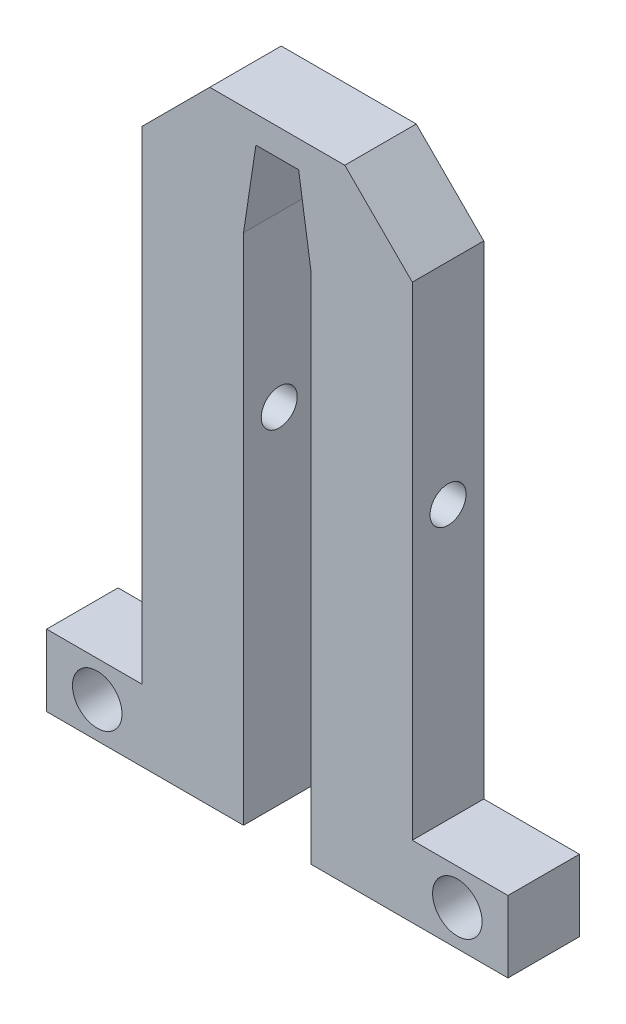
ISO-10303-21;
HEADER;
FILE_DESCRIPTION(('STEP AP214'),'2;1');
FILE_NAME('part.step','',(''),(''),'','','');
FILE_SCHEMA(('AUTOMOTIVE_DESIGN { 1 0 10303 214 1 1 1 1 }'));
ENDSEC;
DATA;
#1=APPLICATION_CONTEXT('core data for automotive mechanical design processes');
#2=APPLICATION_PROTOCOL_DEFINITION('international standard','automotive_design',2000,#1);
#3=PRODUCT_CONTEXT('',#1,'mechanical');
#4=PRODUCT('Part','Part','',(#3));
#5=PRODUCT_RELATED_PRODUCT_CATEGORY('part','',(#4));
#6=PRODUCT_DEFINITION_FORMATION('','',#4);
#7=PRODUCT_DEFINITION_CONTEXT('part definition',#1,'design');
#8=PRODUCT_DEFINITION('design','',#6,#7);
#9=PRODUCT_DEFINITION_SHAPE('','',#8);
#10=(LENGTH_UNIT() NAMED_UNIT(*) SI_UNIT(.MILLI.,.METRE.));
#11=(NAMED_UNIT(*) PLANE_ANGLE_UNIT() SI_UNIT($,.RADIAN.));
#12=(NAMED_UNIT(*) SI_UNIT($,.STERADIAN.) SOLID_ANGLE_UNIT());
#13=UNCERTAINTY_MEASURE_WITH_UNIT(LENGTH_MEASURE(1.E-05),#10,'distance_accuracy_value','');
#14=(GEOMETRIC_REPRESENTATION_CONTEXT(3) GLOBAL_UNCERTAINTY_ASSIGNED_CONTEXT((#13)) GLOBAL_UNIT_ASSIGNED_CONTEXT((#10,
#11,#12)) REPRESENTATION_CONTEXT('',''));
#15=CARTESIAN_POINT('',(0.,0.,0.));
#16=DIRECTION('',(0.,0.,1.));
#17=DIRECTION('',(1.,0.,0.));
#18=AXIS2_PLACEMENT_3D('',#15,#16,#17);
#19=CARTESIAN_POINT('',(10.25,3.175,3.175));
#20=DIRECTION('',(-1.,0.,0.));
#21=DIRECTION('',(0.,0.,1.));
#22=AXIS2_PLACEMENT_3D('',#19,#20,#21);
#23=PLANE('',#22);
#24=DIRECTION('',(0.,1.,0.));
#25=VECTOR('',#24,1.);
#26=CARTESIAN_POINT('',(10.25,3.175,0.));
#27=LINE('',#26,#25);
#28=CARTESIAN_POINT('',(10.25,0.,0.));
#29=VERTEX_POINT('',#28);
#30=CARTESIAN_POINT('',(10.25,3.175,0.));
#31=VERTEX_POINT('',#30);
#32=EDGE_CURVE('E174',#29,#31,#27,.T.);
#33=ORIENTED_EDGE('',*,*,#32,.T.);
#34=DIRECTION('',(0.,0.,-1.));
#35=VECTOR('',#34,1.);
#36=CARTESIAN_POINT('',(10.25,3.175,3.175));
#37=LINE('',#36,#35);
#38=CARTESIAN_POINT('',(10.25,3.175,3.175));
#39=VERTEX_POINT('',#38);
#40=EDGE_CURVE('E156',#39,#31,#37,.T.);
#41=ORIENTED_EDGE('',*,*,#40,.F.);
#42=DIRECTION('',(0.,1.,0.));
#43=VECTOR('',#42,1.);
#44=CARTESIAN_POINT('',(10.25,3.175,3.175));
#45=LINE('',#44,#43);
#46=CARTESIAN_POINT('',(10.25,0.,3.175));
#47=VERTEX_POINT('',#46);
#48=EDGE_CURVE('E162',#47,#39,#45,.T.);
#49=ORIENTED_EDGE('',*,*,#48,.F.);
#50=DIRECTION('',(0.,0.,-1.));
#51=VECTOR('',#50,1.);
#52=CARTESIAN_POINT('',(10.25,0.,3.175));
#53=LINE('',#52,#51);
#54=EDGE_CURVE('E240',#47,#29,#53,.T.);
#55=ORIENTED_EDGE('',*,*,#54,.T.);
#56=EDGE_LOOP('',(#33,#41,#49,#55));
#57=FACE_BOUND('',#56,.T.);
#58=ADVANCED_FACE('F35',(#57),#23,.F.);
#59=CARTESIAN_POINT('',(6.,3.175,3.175));
#60=DIRECTION('',(0.,-1.,0.));
#61=DIRECTION('',(1.,0.,0.));
#62=AXIS2_PLACEMENT_3D('',#59,#60,#61);
#63=PLANE('',#62);
#64=DIRECTION('',(-1.,0.,0.));
#65=VECTOR('',#64,1.);
#66=CARTESIAN_POINT('',(6.,3.175,0.));
#67=LINE('',#66,#65);
#68=CARTESIAN_POINT('',(6.,3.175,0.));
#69=VERTEX_POINT('',#68);
#70=EDGE_CURVE('E220',#31,#69,#67,.T.);
#71=ORIENTED_EDGE('',*,*,#70,.T.);
#72=DIRECTION('',(0.,0.,-1.));
#73=VECTOR('',#72,1.);
#74=CARTESIAN_POINT('',(6.,3.175,3.175));
#75=LINE('',#74,#73);
#76=CARTESIAN_POINT('',(6.,3.175,3.175));
#77=VERTEX_POINT('',#76);
#78=EDGE_CURVE('E159',#77,#69,#75,.T.);
#79=ORIENTED_EDGE('',*,*,#78,.F.);
#80=DIRECTION('',(-1.,0.,0.));
#81=VECTOR('',#80,1.);
#82=CARTESIAN_POINT('',(6.,3.175,3.175));
#83=LINE('',#82,#81);
#84=EDGE_CURVE('E152',#39,#77,#83,.T.);
#85=ORIENTED_EDGE('',*,*,#84,.F.);
#86=ORIENTED_EDGE('',*,*,#40,.T.);
#87=EDGE_LOOP('',(#71,#79,#85,#86));
#88=FACE_BOUND('',#87,.T.);
#89=ADVANCED_FACE('F154',(#88),#63,.F.);
#90=CARTESIAN_POINT('',(6.,27.65,3.175));
#91=DIRECTION('',(-1.,0.,0.));
#92=DIRECTION('',(0.,-1.,0.));
#93=AXIS2_PLACEMENT_3D('',#90,#91,#92);
#94=PLANE('',#93);
#95=CARTESIAN_POINT('',(6.,15.3,1.5875));
#96=DIRECTION('',(1.,0.,0.));
#97=DIRECTION('',(0.,0.,-1.));
#98=AXIS2_PLACEMENT_3D('',#95,#96,#97);
#99=CIRCLE('',#98,0.799999999999988);
#100=CARTESIAN_POINT('',(6.,15.3,0.787500000000014));
#101=VERTEX_POINT('',#100);
#102=EDGE_CURVE('E310',#101,#101,#99,.T.);
#103=ORIENTED_EDGE('',*,*,#102,.F.);
#104=EDGE_LOOP('',(#103));
#105=FACE_BOUND('',#104,.T.);
#106=DIRECTION('',(0.,1.,0.));
#107=VECTOR('',#106,1.);
#108=CARTESIAN_POINT('',(6.,27.65,0.));
#109=LINE('',#108,#107);
#110=CARTESIAN_POINT('',(6.,24.65,0.));
#111=VERTEX_POINT('',#110);
#112=EDGE_CURVE('E216',#69,#111,#109,.T.);
#113=ORIENTED_EDGE('',*,*,#112,.T.);
#114=DIRECTION('',(0.,0.,1.));
#115=VECTOR('',#114,1.);
#116=CARTESIAN_POINT('',(6.,24.65,3.175));
#117=LINE('',#116,#115);
#118=CARTESIAN_POINT('',(6.,24.65,3.175));
#119=VERTEX_POINT('',#118);
#120=EDGE_CURVE('E11',#111,#119,#117,.T.);
#121=ORIENTED_EDGE('',*,*,#120,.T.);
#122=DIRECTION('',(0.,1.,0.));
#123=VECTOR('',#122,1.);
#124=CARTESIAN_POINT('',(6.,27.65,3.175));
#125=LINE('',#124,#123);
#126=EDGE_CURVE('E161',#77,#119,#125,.T.);
#127=ORIENTED_EDGE('',*,*,#126,.F.);
#128=ORIENTED_EDGE('',*,*,#78,.T.);
#129=EDGE_LOOP('',(#113,#121,#127,#128));
#130=FACE_BOUND('',#129,.T.);
#131=ADVANCED_FACE('F299',(#105,#130),#94,.F.);
#132=CARTESIAN_POINT('',(6.,27.65,3.175));
#133=DIRECTION('',(0.,-1.,0.));
#134=DIRECTION('',(0.,0.,-1.));
#135=AXIS2_PLACEMENT_3D('',#132,#133,#134);
#136=PLANE('',#135);
#137=DIRECTION('',(-1.,0.,0.));
#138=VECTOR('',#137,1.);
#139=CARTESIAN_POINT('',(6.,27.65,0.));
#140=LINE('',#139,#138);
#141=CARTESIAN_POINT('',(3.,27.65,0.));
#142=VERTEX_POINT('',#141);
#143=CARTESIAN_POINT('',(-2.99999999999999,27.65,0.));
#144=VERTEX_POINT('',#143);
#145=EDGE_CURVE('E211',#142,#144,#140,.T.);
#146=ORIENTED_EDGE('',*,*,#145,.T.);
#147=DIRECTION('',(0.,0.,1.));
#148=VECTOR('',#147,1.);
#149=CARTESIAN_POINT('',(-2.99999999999999,27.65,3.175));
#150=LINE('',#149,#148);
#151=CARTESIAN_POINT('',(-2.99999999999999,27.65,3.175));
#152=VERTEX_POINT('',#151);
#153=EDGE_CURVE('E58',#144,#152,#150,.T.);
#154=ORIENTED_EDGE('',*,*,#153,.T.);
#155=DIRECTION('',(-1.,0.,0.));
#156=VECTOR('',#155,1.);
#157=CARTESIAN_POINT('',(6.,27.65,3.175));
#158=LINE('',#157,#156);
#159=CARTESIAN_POINT('',(3.,27.65,3.175));
#160=VERTEX_POINT('',#159);
#161=EDGE_CURVE('E197',#160,#152,#158,.T.);
#162=ORIENTED_EDGE('',*,*,#161,.F.);
#163=DIRECTION('',(0.,0.,-1.));
#164=VECTOR('',#163,1.);
#165=CARTESIAN_POINT('',(3.,27.65,3.175));
#166=LINE('',#165,#164);
#167=EDGE_CURVE('E187',#160,#142,#166,.T.);
#168=ORIENTED_EDGE('',*,*,#167,.T.);
#169=EDGE_LOOP('',(#146,#154,#162,#168));
#170=FACE_BOUND('',#169,.T.);
#171=ADVANCED_FACE('F214',(#170),#136,.F.);
#172=CARTESIAN_POINT('',(-6.,27.65,3.175));
#173=DIRECTION('',(1.,0.,0.));
#174=DIRECTION('',(0.,1.,0.));
#175=AXIS2_PLACEMENT_3D('',#172,#173,#174);
#176=PLANE('',#175);
#177=CARTESIAN_POINT('',(-6.,15.3,1.5875));
#178=DIRECTION('',(1.,0.,0.));
#179=DIRECTION('',(0.,1.,0.));
#180=AXIS2_PLACEMENT_3D('',#177,#178,#179);
#181=CIRCLE('',#180,0.799999999999993);
#182=CARTESIAN_POINT('',(-6.,16.1,1.5875));
#183=VERTEX_POINT('',#182);
#184=EDGE_CURVE('E297',#183,#183,#181,.T.);
#185=ORIENTED_EDGE('',*,*,#184,.T.);
#186=EDGE_LOOP('',(#185));
#187=FACE_BOUND('',#186,.T.);
#188=DIRECTION('',(0.,-1.,0.));
#189=VECTOR('',#188,1.);
#190=CARTESIAN_POINT('',(-6.,27.65,3.175));
#191=LINE('',#190,#189);
#192=CARTESIAN_POINT('',(-6.,24.65,3.175));
#193=VERTEX_POINT('',#192);
#194=CARTESIAN_POINT('',(-6.,3.175,3.175));
#195=VERTEX_POINT('',#194);
#196=EDGE_CURVE('E195',#193,#195,#191,.T.);
#197=ORIENTED_EDGE('',*,*,#196,.F.);
#198=DIRECTION('',(0.,0.,-1.));
#199=VECTOR('',#198,1.);
#200=CARTESIAN_POINT('',(-6.,24.65,3.175));
#201=LINE('',#200,#199);
#202=CARTESIAN_POINT('',(-6.,24.65,0.));
#203=VERTEX_POINT('',#202);
#204=EDGE_CURVE('E175',#193,#203,#201,.T.);
#205=ORIENTED_EDGE('',*,*,#204,.T.);
#206=DIRECTION('',(0.,-1.,0.));
#207=VECTOR('',#206,1.);
#208=CARTESIAN_POINT('',(-6.,27.65,0.));
#209=LINE('',#208,#207);
#210=CARTESIAN_POINT('',(-6.,3.175,0.));
#211=VERTEX_POINT('',#210);
#212=EDGE_CURVE('E213',#203,#211,#209,.T.);
#213=ORIENTED_EDGE('',*,*,#212,.T.);
#214=DIRECTION('',(0.,0.,-1.));
#215=VECTOR('',#214,1.);
#216=CARTESIAN_POINT('',(-6.,3.175,3.175));
#217=LINE('',#216,#215);
#218=EDGE_CURVE('E180',#195,#211,#217,.T.);
#219=ORIENTED_EDGE('',*,*,#218,.F.);
#220=EDGE_LOOP('',(#197,#205,#213,#219));
#221=FACE_BOUND('',#220,.T.);
#222=ADVANCED_FACE('F201',(#187,#221),#176,.F.);
#223=CARTESIAN_POINT('',(-6.,3.175,3.175));
#224=DIRECTION('',(0.,-1.,0.));
#225=DIRECTION('',(1.,0.,0.));
#226=AXIS2_PLACEMENT_3D('',#223,#224,#225);
#227=PLANE('',#226);
#228=DIRECTION('',(-1.,0.,0.));
#229=VECTOR('',#228,1.);
#230=CARTESIAN_POINT('',(-6.,3.175,0.));
#231=LINE('',#230,#229);
#232=CARTESIAN_POINT('',(-10.25,3.175,0.));
#233=VERTEX_POINT('',#232);
#234=EDGE_CURVE('E218',#211,#233,#231,.T.);
#235=ORIENTED_EDGE('',*,*,#234,.T.);
#236=DIRECTION('',(0.,0.,-1.));
#237=VECTOR('',#236,1.);
#238=CARTESIAN_POINT('',(-10.25,3.175,3.175));
#239=LINE('',#238,#237);
#240=CARTESIAN_POINT('',(-10.25,3.175,3.175));
#241=VERTEX_POINT('',#240);
#242=EDGE_CURVE('E263',#241,#233,#239,.T.);
#243=ORIENTED_EDGE('',*,*,#242,.F.);
#244=DIRECTION('',(-1.,0.,0.));
#245=VECTOR('',#244,1.);
#246=CARTESIAN_POINT('',(-6.,3.175,3.175));
#247=LINE('',#246,#245);
#248=EDGE_CURVE('E205',#195,#241,#247,.T.);
#249=ORIENTED_EDGE('',*,*,#248,.F.);
#250=ORIENTED_EDGE('',*,*,#218,.T.);
#251=EDGE_LOOP('',(#235,#243,#249,#250));
#252=FACE_BOUND('',#251,.T.);
#253=ADVANCED_FACE('F266',(#252),#227,.F.);
#254=CARTESIAN_POINT('',(-10.25,3.175,3.175));
#255=DIRECTION('',(1.,0.,0.));
#256=DIRECTION('',(0.,0.,-1.));
#257=AXIS2_PLACEMENT_3D('',#254,#255,#256);
#258=PLANE('',#257);
#259=DIRECTION('',(0.,-1.,0.));
#260=VECTOR('',#259,1.);
#261=CARTESIAN_POINT('',(-10.25,3.175,0.));
#262=LINE('',#261,#260);
#263=CARTESIAN_POINT('',(-10.25,0.,0.));
#264=VERTEX_POINT('',#263);
#265=EDGE_CURVE('E225',#233,#264,#262,.T.);
#266=ORIENTED_EDGE('',*,*,#265,.T.);
#267=DIRECTION('',(0.,0.,-1.));
#268=VECTOR('',#267,1.);
#269=CARTESIAN_POINT('',(-10.25,0.,3.175));
#270=LINE('',#269,#268);
#271=CARTESIAN_POINT('',(-10.25,0.,3.175));
#272=VERTEX_POINT('',#271);
#273=EDGE_CURVE('E260',#272,#264,#270,.T.);
#274=ORIENTED_EDGE('',*,*,#273,.F.);
#275=DIRECTION('',(0.,-1.,0.));
#276=VECTOR('',#275,1.);
#277=CARTESIAN_POINT('',(-10.25,3.175,3.175));
#278=LINE('',#277,#276);
#279=EDGE_CURVE('E282',#241,#272,#278,.T.);
#280=ORIENTED_EDGE('',*,*,#279,.F.);
#281=ORIENTED_EDGE('',*,*,#242,.T.);
#282=EDGE_LOOP('',(#266,#274,#280,#281));
#283=FACE_BOUND('',#282,.T.);
#284=ADVANCED_FACE('F273',(#283),#258,.F.);
#285=CARTESIAN_POINT('',(-10.25,0.,3.175));
#286=DIRECTION('',(0.,1.,0.));
#287=DIRECTION('',(0.,0.,1.));
#288=AXIS2_PLACEMENT_3D('',#285,#286,#287);
#289=PLANE('',#288);
#290=DIRECTION('',(1.,0.,0.));
#291=VECTOR('',#290,1.);
#292=CARTESIAN_POINT('',(-10.25,0.,0.));
#293=LINE('',#292,#291);
#294=CARTESIAN_POINT('',(-1.5,0.,0.));
#295=VERTEX_POINT('',#294);
#296=EDGE_CURVE('E227',#264,#295,#293,.T.);
#297=ORIENTED_EDGE('',*,*,#296,.T.);
#298=DIRECTION('',(0.,0.,-1.));
#299=VECTOR('',#298,1.);
#300=CARTESIAN_POINT('',(-1.5,0.,3.175));
#301=LINE('',#300,#299);
#302=CARTESIAN_POINT('',(-1.5,0.,3.175));
#303=VERTEX_POINT('',#302);
#304=EDGE_CURVE('E257',#303,#295,#301,.T.);
#305=ORIENTED_EDGE('',*,*,#304,.F.);
#306=DIRECTION('',(1.,0.,0.));
#307=VECTOR('',#306,1.);
#308=CARTESIAN_POINT('',(-10.25,0.,3.175));
#309=LINE('',#308,#307);
#310=EDGE_CURVE('E279',#272,#303,#309,.T.);
#311=ORIENTED_EDGE('',*,*,#310,.F.);
#312=ORIENTED_EDGE('',*,*,#273,.T.);
#313=EDGE_LOOP('',(#297,#305,#311,#312));
#314=FACE_BOUND('',#313,.T.);
#315=ADVANCED_FACE('F277',(#314),#289,.F.);
#316=CARTESIAN_POINT('',(-1.5,22.8,3.175));
#317=DIRECTION('',(-1.,0.,0.));
#318=DIRECTION('',(0.,-1.,0.));
#319=AXIS2_PLACEMENT_3D('',#316,#317,#318);
#320=PLANE('',#319);
#321=CARTESIAN_POINT('',(-1.5,15.3,1.5875));
#322=DIRECTION('',(-1.,0.,0.));
#323=DIRECTION('',(0.,-1.,0.));
#324=AXIS2_PLACEMENT_3D('',#321,#322,#323);
#325=CIRCLE('',#324,0.799999999999993);
#326=CARTESIAN_POINT('',(-1.5,14.5,1.5875));
#327=VERTEX_POINT('',#326);
#328=EDGE_CURVE('E307',#327,#327,#325,.T.);
#329=ORIENTED_EDGE('',*,*,#328,.T.);
#330=EDGE_LOOP('',(#329));
#331=FACE_BOUND('',#330,.T.);
#332=DIRECTION('',(0.,1.,0.));
#333=VECTOR('',#332,1.);
#334=CARTESIAN_POINT('',(-1.5,22.8,0.));
#335=LINE('',#334,#333);
#336=CARTESIAN_POINT('',(-1.5,22.8,0.));
#337=VERTEX_POINT('',#336);
#338=EDGE_CURVE('E229',#295,#337,#335,.T.);
#339=ORIENTED_EDGE('',*,*,#338,.T.);
#340=DIRECTION('',(0.,0.,-1.));
#341=VECTOR('',#340,1.);
#342=CARTESIAN_POINT('',(-1.5,22.8,3.175));
#343=LINE('',#342,#341);
#344=CARTESIAN_POINT('',(-1.5,22.8,3.175));
#345=VERTEX_POINT('',#344);
#346=EDGE_CURVE('E254',#345,#337,#343,.T.);
#347=ORIENTED_EDGE('',*,*,#346,.F.);
#348=DIRECTION('',(0.,1.,0.));
#349=VECTOR('',#348,1.);
#350=CARTESIAN_POINT('',(-1.5,22.8,3.175));
#351=LINE('',#350,#349);
#352=EDGE_CURVE('E281',#303,#345,#351,.T.);
#353=ORIENTED_EDGE('',*,*,#352,.F.);
#354=ORIENTED_EDGE('',*,*,#304,.T.);
#355=EDGE_LOOP('',(#339,#347,#353,#354));
#356=FACE_BOUND('',#355,.T.);
#357=ADVANCED_FACE('F388',(#331,#356),#320,.F.);
#358=CARTESIAN_POINT('',(-0.95,26.45,3.175));
#359=DIRECTION('',(-0.988836773758751,0.149002801525291,0.));
#360=DIRECTION('',(-0.149002801525292,-0.988836773758751,0.));
#361=AXIS2_PLACEMENT_3D('',#358,#359,#360);
#362=PLANE('',#361);
#363=DIRECTION('',(0.149002801525291,0.988836773758751,0.));
#364=VECTOR('',#363,1.);
#365=CARTESIAN_POINT('',(-0.95,26.45,0.));
#366=LINE('',#365,#364);
#367=CARTESIAN_POINT('',(-0.95,26.45,0.));
#368=VERTEX_POINT('',#367);
#369=EDGE_CURVE('E231',#337,#368,#366,.T.);
#370=ORIENTED_EDGE('',*,*,#369,.T.);
#371=DIRECTION('',(0.,0.,-1.));
#372=VECTOR('',#371,1.);
#373=CARTESIAN_POINT('',(-0.95,26.45,3.175));
#374=LINE('',#373,#372);
#375=CARTESIAN_POINT('',(-0.95,26.45,3.175));
#376=VERTEX_POINT('',#375);
#377=EDGE_CURVE('E251',#376,#368,#374,.T.);
#378=ORIENTED_EDGE('',*,*,#377,.F.);
#379=DIRECTION('',(0.149002801525291,0.988836773758751,0.));
#380=VECTOR('',#379,1.);
#381=CARTESIAN_POINT('',(-0.95,26.45,3.175));
#382=LINE('',#381,#380);
#383=EDGE_CURVE('E284',#345,#376,#382,.T.);
#384=ORIENTED_EDGE('',*,*,#383,.F.);
#385=ORIENTED_EDGE('',*,*,#346,.T.);
#386=EDGE_LOOP('',(#370,#378,#384,#385));
#387=FACE_BOUND('',#386,.T.);
#388=ADVANCED_FACE('F384',(#387),#362,.F.);
#389=CARTESIAN_POINT('',(-0.95,26.45,3.175));
#390=DIRECTION('',(0.,1.,0.));
#391=DIRECTION('',(0.,0.,1.));
#392=AXIS2_PLACEMENT_3D('',#389,#390,#391);
#393=PLANE('',#392);
#394=DIRECTION('',(1.,0.,0.));
#395=VECTOR('',#394,1.);
#396=CARTESIAN_POINT('',(-0.95,26.45,0.));
#397=LINE('',#396,#395);
#398=CARTESIAN_POINT('',(0.95,26.45,0.));
#399=VERTEX_POINT('',#398);
#400=EDGE_CURVE('E233',#368,#399,#397,.T.);
#401=ORIENTED_EDGE('',*,*,#400,.T.);
#402=DIRECTION('',(0.,0.,-1.));
#403=VECTOR('',#402,1.);
#404=CARTESIAN_POINT('',(0.95,26.45,3.175));
#405=LINE('',#404,#403);
#406=CARTESIAN_POINT('',(0.95,26.45,3.175));
#407=VERTEX_POINT('',#406);
#408=EDGE_CURVE('E248',#407,#399,#405,.T.);
#409=ORIENTED_EDGE('',*,*,#408,.F.);
#410=DIRECTION('',(1.,0.,0.));
#411=VECTOR('',#410,1.);
#412=CARTESIAN_POINT('',(-0.95,26.45,3.175));
#413=LINE('',#412,#411);
#414=EDGE_CURVE('E290',#376,#407,#413,.T.);
#415=ORIENTED_EDGE('',*,*,#414,.F.);
#416=ORIENTED_EDGE('',*,*,#377,.T.);
#417=EDGE_LOOP('',(#401,#409,#415,#416));
#418=FACE_BOUND('',#417,.T.);
#419=ADVANCED_FACE('F380',(#418),#393,.F.);
#420=CARTESIAN_POINT('',(0.95,26.45,3.175));
#421=DIRECTION('',(0.988836773758751,0.149002801525291,0.));
#422=DIRECTION('',(-0.149002801525292,0.988836773758751,0.));
#423=AXIS2_PLACEMENT_3D('',#420,#421,#422);
#424=PLANE('',#423);
#425=DIRECTION('',(0.149002801525291,-0.988836773758751,0.));
#426=VECTOR('',#425,1.);
#427=CARTESIAN_POINT('',(0.95,26.45,0.));
#428=LINE('',#427,#426);
#429=CARTESIAN_POINT('',(1.5,22.8,0.));
#430=VERTEX_POINT('',#429);
#431=EDGE_CURVE('E235',#399,#430,#428,.T.);
#432=ORIENTED_EDGE('',*,*,#431,.T.);
#433=DIRECTION('',(0.,0.,-1.));
#434=VECTOR('',#433,1.);
#435=CARTESIAN_POINT('',(1.5,22.8,3.175));
#436=LINE('',#435,#434);
#437=CARTESIAN_POINT('',(1.5,22.8,3.175));
#438=VERTEX_POINT('',#437);
#439=EDGE_CURVE('E245',#438,#430,#436,.T.);
#440=ORIENTED_EDGE('',*,*,#439,.F.);
#441=DIRECTION('',(0.149002801525291,-0.988836773758751,0.));
#442=VECTOR('',#441,1.);
#443=CARTESIAN_POINT('',(0.95,26.45,3.175));
#444=LINE('',#443,#442);
#445=EDGE_CURVE('E292',#407,#438,#444,.T.);
#446=ORIENTED_EDGE('',*,*,#445,.F.);
#447=ORIENTED_EDGE('',*,*,#408,.T.);
#448=EDGE_LOOP('',(#432,#440,#446,#447));
#449=FACE_BOUND('',#448,.T.);
#450=ADVANCED_FACE('F376',(#449),#424,.F.);
#451=CARTESIAN_POINT('',(1.5,22.8,3.175));
#452=DIRECTION('',(1.,0.,0.));
#453=DIRECTION('',(0.,1.,0.));
#454=AXIS2_PLACEMENT_3D('',#451,#452,#453);
#455=PLANE('',#454);
#456=CARTESIAN_POINT('',(1.5,15.3,1.5875));
#457=DIRECTION('',(1.,0.,0.));
#458=DIRECTION('',(0.,1.,0.));
#459=AXIS2_PLACEMENT_3D('',#456,#457,#458);
#460=CIRCLE('',#459,0.799999999999993);
#461=CARTESIAN_POINT('',(1.5,16.1,1.5875));
#462=VERTEX_POINT('',#461);
#463=EDGE_CURVE('E40',#462,#462,#460,.T.);
#464=ORIENTED_EDGE('',*,*,#463,.T.);
#465=EDGE_LOOP('',(#464));
#466=FACE_BOUND('',#465,.T.);
#467=DIRECTION('',(0.,-1.,0.));
#468=VECTOR('',#467,1.);
#469=CARTESIAN_POINT('',(1.5,22.8,0.));
#470=LINE('',#469,#468);
#471=CARTESIAN_POINT('',(1.5,0.,0.));
#472=VERTEX_POINT('',#471);
#473=EDGE_CURVE('E237',#430,#472,#470,.T.);
#474=ORIENTED_EDGE('',*,*,#473,.T.);
#475=DIRECTION('',(0.,0.,-1.));
#476=VECTOR('',#475,1.);
#477=CARTESIAN_POINT('',(1.5,0.,3.175));
#478=LINE('',#477,#476);
#479=CARTESIAN_POINT('',(1.5,0.,3.175));
#480=VERTEX_POINT('',#479);
#481=EDGE_CURVE('E242',#480,#472,#478,.T.);
#482=ORIENTED_EDGE('',*,*,#481,.F.);
#483=DIRECTION('',(0.,-1.,0.));
#484=VECTOR('',#483,1.);
#485=CARTESIAN_POINT('',(1.5,22.8,3.175));
#486=LINE('',#485,#484);
#487=EDGE_CURVE('E294',#438,#480,#486,.T.);
#488=ORIENTED_EDGE('',*,*,#487,.F.);
#489=ORIENTED_EDGE('',*,*,#439,.T.);
#490=EDGE_LOOP('',(#474,#482,#488,#489));
#491=FACE_BOUND('',#490,.T.);
#492=ADVANCED_FACE('F372',(#466,#491),#455,.F.);
#493=CARTESIAN_POINT('',(10.25,0.,3.175));
#494=DIRECTION('',(0.,1.,0.));
#495=DIRECTION('',(-1.,0.,0.));
#496=AXIS2_PLACEMENT_3D('',#493,#494,#495);
#497=PLANE('',#496);
#498=DIRECTION('',(1.,0.,0.));
#499=VECTOR('',#498,1.);
#500=CARTESIAN_POINT('',(10.25,0.,0.));
#501=LINE('',#500,#499);
#502=EDGE_CURVE('E171',#472,#29,#501,.T.);
#503=ORIENTED_EDGE('',*,*,#502,.T.);
#504=ORIENTED_EDGE('',*,*,#54,.F.);
#505=DIRECTION('',(1.,0.,0.));
#506=VECTOR('',#505,1.);
#507=CARTESIAN_POINT('',(10.25,0.,3.175));
#508=LINE('',#507,#506);
#509=EDGE_CURVE('E167',#480,#47,#508,.T.);
#510=ORIENTED_EDGE('',*,*,#509,.F.);
#511=ORIENTED_EDGE('',*,*,#481,.T.);
#512=EDGE_LOOP('',(#503,#504,#510,#511));
#513=FACE_BOUND('',#512,.T.);
#514=ADVANCED_FACE('F330',(#513),#497,.F.);
#515=CARTESIAN_POINT('',(0.,0.,3.175));
#516=DIRECTION('',(0.,0.,-1.));
#517=DIRECTION('',(-1.,0.,0.));
#518=AXIS2_PLACEMENT_3D('',#515,#516,#517);
#519=PLANE('',#518);
#520=CARTESIAN_POINT('',(-8.,1.5875,3.175));
#521=DIRECTION('',(0.,0.,1.));
#522=DIRECTION('',(1.,0.,0.));
#523=AXIS2_PLACEMENT_3D('',#520,#521,#522);
#524=CIRCLE('',#523,1.1);
#525=CARTESIAN_POINT('',(-6.9,1.5875,3.175));
#526=VERTEX_POINT('',#525);
#527=EDGE_CURVE('E322',#526,#526,#524,.T.);
#528=ORIENTED_EDGE('',*,*,#527,.F.);
#529=EDGE_LOOP('',(#528));
#530=FACE_BOUND('',#529,.T.);
#531=CARTESIAN_POINT('',(8.,1.5875,3.175));
#532=DIRECTION('',(0.,0.,1.));
#533=DIRECTION('',(1.,0.,0.));
#534=AXIS2_PLACEMENT_3D('',#531,#532,#533);
#535=CIRCLE('',#534,1.1);
#536=CARTESIAN_POINT('',(9.1,1.5875,3.175));
#537=VERTEX_POINT('',#536);
#538=EDGE_CURVE('E316',#537,#537,#535,.T.);
#539=ORIENTED_EDGE('',*,*,#538,.F.);
#540=EDGE_LOOP('',(#539));
#541=FACE_BOUND('',#540,.T.);
#542=ORIENTED_EDGE('',*,*,#161,.T.);
#543=DIRECTION('',(0.707106781186549,0.707106781186546,0.));
#544=VECTOR('',#543,1.);
#545=CARTESIAN_POINT('',(-6.,24.65,3.175));
#546=LINE('',#545,#544);
#547=EDGE_CURVE('E45',#152,#193,#546,.F.);
#548=ORIENTED_EDGE('',*,*,#547,.T.);
#549=ORIENTED_EDGE('',*,*,#196,.T.);
#550=ORIENTED_EDGE('',*,*,#248,.T.);
#551=ORIENTED_EDGE('',*,*,#279,.T.);
#552=ORIENTED_EDGE('',*,*,#310,.T.);
#553=ORIENTED_EDGE('',*,*,#352,.T.);
#554=ORIENTED_EDGE('',*,*,#383,.T.);
#555=ORIENTED_EDGE('',*,*,#414,.T.);
#556=ORIENTED_EDGE('',*,*,#445,.T.);
#557=ORIENTED_EDGE('',*,*,#487,.T.);
#558=ORIENTED_EDGE('',*,*,#509,.T.);
#559=ORIENTED_EDGE('',*,*,#48,.T.);
#560=ORIENTED_EDGE('',*,*,#84,.T.);
#561=ORIENTED_EDGE('',*,*,#126,.T.);
#562=DIRECTION('',(0.707106781186546,-0.707106781186549,0.));
#563=VECTOR('',#562,1.);
#564=CARTESIAN_POINT('',(3.,27.65,3.175));
#565=LINE('',#564,#563);
#566=EDGE_CURVE('E191',#119,#160,#565,.F.);
#567=ORIENTED_EDGE('',*,*,#566,.T.);
#568=EDGE_LOOP('',(#542,#548,#549,#550,#551,#552,#553,#554,#555,#556,#557,#558,#559,#560,#561,#567));
#569=FACE_BOUND('',#568,.T.);
#570=ADVANCED_FACE('F165',(#530,#541,#569),#519,.F.);
#571=CARTESIAN_POINT('',(0.,0.,0.));
#572=DIRECTION('',(0.,0.,-1.));
#573=DIRECTION('',(-1.,0.,0.));
#574=AXIS2_PLACEMENT_3D('',#571,#572,#573);
#575=PLANE('',#574);
#576=CARTESIAN_POINT('',(-8.,1.5875,0.));
#577=DIRECTION('',(0.,0.,1.));
#578=DIRECTION('',(1.,0.,0.));
#579=AXIS2_PLACEMENT_3D('',#576,#577,#578);
#580=CIRCLE('',#579,1.1);
#581=CARTESIAN_POINT('',(-6.9,1.5875,0.));
#582=VERTEX_POINT('',#581);
#583=EDGE_CURVE('E319',#582,#582,#580,.T.);
#584=ORIENTED_EDGE('',*,*,#583,.T.);
#585=EDGE_LOOP('',(#584));
#586=FACE_BOUND('',#585,.T.);
#587=CARTESIAN_POINT('',(8.,1.5875,0.));
#588=DIRECTION('',(0.,0.,1.));
#589=DIRECTION('',(1.,0.,0.));
#590=AXIS2_PLACEMENT_3D('',#587,#588,#589);
#591=CIRCLE('',#590,1.1);
#592=CARTESIAN_POINT('',(9.1,1.5875,0.));
#593=VERTEX_POINT('',#592);
#594=EDGE_CURVE('E313',#593,#593,#591,.T.);
#595=ORIENTED_EDGE('',*,*,#594,.T.);
#596=EDGE_LOOP('',(#595));
#597=FACE_BOUND('',#596,.T.);
#598=ORIENTED_EDGE('',*,*,#212,.F.);
#599=DIRECTION('',(-0.707106781186549,-0.707106781186546,0.));
#600=VECTOR('',#599,1.);
#601=CARTESIAN_POINT('',(-15.325,15.325,0.));
#602=LINE('',#601,#600);
#603=EDGE_CURVE('E185',#203,#144,#602,.F.);
#604=ORIENTED_EDGE('',*,*,#603,.T.);
#605=ORIENTED_EDGE('',*,*,#145,.F.);
#606=DIRECTION('',(-0.707106781186546,0.707106781186549,0.));
#607=VECTOR('',#606,1.);
#608=CARTESIAN_POINT('',(15.325,15.325,0.));
#609=LINE('',#608,#607);
#610=EDGE_CURVE('E178',#142,#111,#609,.F.);
#611=ORIENTED_EDGE('',*,*,#610,.T.);
#612=ORIENTED_EDGE('',*,*,#112,.F.);
#613=ORIENTED_EDGE('',*,*,#70,.F.);
#614=ORIENTED_EDGE('',*,*,#32,.F.);
#615=ORIENTED_EDGE('',*,*,#502,.F.);
#616=ORIENTED_EDGE('',*,*,#473,.F.);
#617=ORIENTED_EDGE('',*,*,#431,.F.);
#618=ORIENTED_EDGE('',*,*,#400,.F.);
#619=ORIENTED_EDGE('',*,*,#369,.F.);
#620=ORIENTED_EDGE('',*,*,#338,.F.);
#621=ORIENTED_EDGE('',*,*,#296,.F.);
#622=ORIENTED_EDGE('',*,*,#265,.F.);
#623=ORIENTED_EDGE('',*,*,#234,.F.);
#624=EDGE_LOOP('',(#598,#604,#605,#611,#612,#613,#614,#615,#616,#617,#618,#619,#620,#621,#622,#623));
#625=FACE_BOUND('',#624,.T.);
#626=ADVANCED_FACE('F210',(#586,#597,#625),#575,.T.);
#627=CARTESIAN_POINT('',(-6.,24.65,3.175));
#628=DIRECTION('',(0.707106781186546,-0.707106781186549,0.));
#629=DIRECTION('',(0.,0.,-1.));
#630=AXIS2_PLACEMENT_3D('',#627,#628,#629);
#631=PLANE('',#630);
#632=ORIENTED_EDGE('',*,*,#547,.F.);
#633=ORIENTED_EDGE('',*,*,#153,.F.);
#634=ORIENTED_EDGE('',*,*,#603,.F.);
#635=ORIENTED_EDGE('',*,*,#204,.F.);
#636=EDGE_LOOP('',(#632,#633,#634,#635));
#637=FACE_BOUND('',#636,.T.);
#638=ADVANCED_FACE('F207',(#637),#631,.F.);
#639=CARTESIAN_POINT('',(3.,27.65,3.175));
#640=DIRECTION('',(-0.707106781186549,-0.707106781186546,0.));
#641=DIRECTION('',(0.,0.,-1.));
#642=AXIS2_PLACEMENT_3D('',#639,#640,#641);
#643=PLANE('',#642);
#644=ORIENTED_EDGE('',*,*,#566,.F.);
#645=ORIENTED_EDGE('',*,*,#120,.F.);
#646=ORIENTED_EDGE('',*,*,#610,.F.);
#647=ORIENTED_EDGE('',*,*,#167,.F.);
#648=EDGE_LOOP('',(#644,#645,#646,#647));
#649=FACE_BOUND('',#648,.T.);
#650=ADVANCED_FACE('F38',(#649),#643,.F.);
#651=CARTESIAN_POINT('',(6.,15.3,1.5875));
#652=DIRECTION('',(1.,0.,0.));
#653=DIRECTION('',(0.,0.,-1.));
#654=AXIS2_PLACEMENT_3D('',#651,#652,#653);
#655=CYLINDRICAL_SURFACE('',#654,0.799999999999993);
#656=ORIENTED_EDGE('',*,*,#102,.T.);
#657=EDGE_LOOP('',(#656));
#658=FACE_BOUND('',#657,.T.);
#659=ORIENTED_EDGE('',*,*,#463,.F.);
#660=EDGE_LOOP('',(#659));
#661=FACE_BOUND('',#660,.T.);
#662=ADVANCED_FACE('F345',(#658,#661),#655,.F.);
#663=ORIENTED_EDGE('',*,*,#328,.F.);
#664=EDGE_LOOP('',(#663));
#665=FACE_BOUND('',#664,.T.);
#666=ORIENTED_EDGE('',*,*,#184,.F.);
#667=EDGE_LOOP('',(#666));
#668=FACE_BOUND('',#667,.T.);
#669=ADVANCED_FACE('F336',(#665,#668),#655,.F.);
#670=CARTESIAN_POINT('',(8.,1.5875,3.175));
#671=DIRECTION('',(0.,0.,1.));
#672=DIRECTION('',(1.,0.,0.));
#673=AXIS2_PLACEMENT_3D('',#670,#671,#672);
#674=CYLINDRICAL_SURFACE('',#673,1.1);
#675=ORIENTED_EDGE('',*,*,#594,.F.);
#676=EDGE_LOOP('',(#675));
#677=FACE_BOUND('',#676,.T.);
#678=ORIENTED_EDGE('',*,*,#538,.T.);
#679=EDGE_LOOP('',(#678));
#680=FACE_BOUND('',#679,.T.);
#681=ADVANCED_FACE('F334',(#677,#680),#674,.F.);
#682=CARTESIAN_POINT('',(-8.,1.5875,3.175));
#683=DIRECTION('',(0.,0.,1.));
#684=DIRECTION('',(1.,0.,0.));
#685=AXIS2_PLACEMENT_3D('',#682,#683,#684);
#686=CYLINDRICAL_SURFACE('',#685,1.1);
#687=ORIENTED_EDGE('',*,*,#583,.F.);
#688=EDGE_LOOP('',(#687));
#689=FACE_BOUND('',#688,.T.);
#690=ORIENTED_EDGE('',*,*,#527,.T.);
#691=EDGE_LOOP('',(#690));
#692=FACE_BOUND('',#691,.T.);
#693=ADVANCED_FACE('F326',(#689,#692),#686,.F.);
#694=CLOSED_SHELL('',(#58,#89,#131,#171,#222,#253,#284,#315,#357,#388,#419,#450,#492,#514,#570,
#626,#638,#650,#662,#669,#681,#693));
#695=MANIFOLD_SOLID_BREP('B2',#694);
#696=ADVANCED_BREP_SHAPE_REPRESENTATION('',(#18,#695),#14);
#697=SHAPE_DEFINITION_REPRESENTATION(#9,#696);
ENDSEC;
END-ISO-10303-21;
